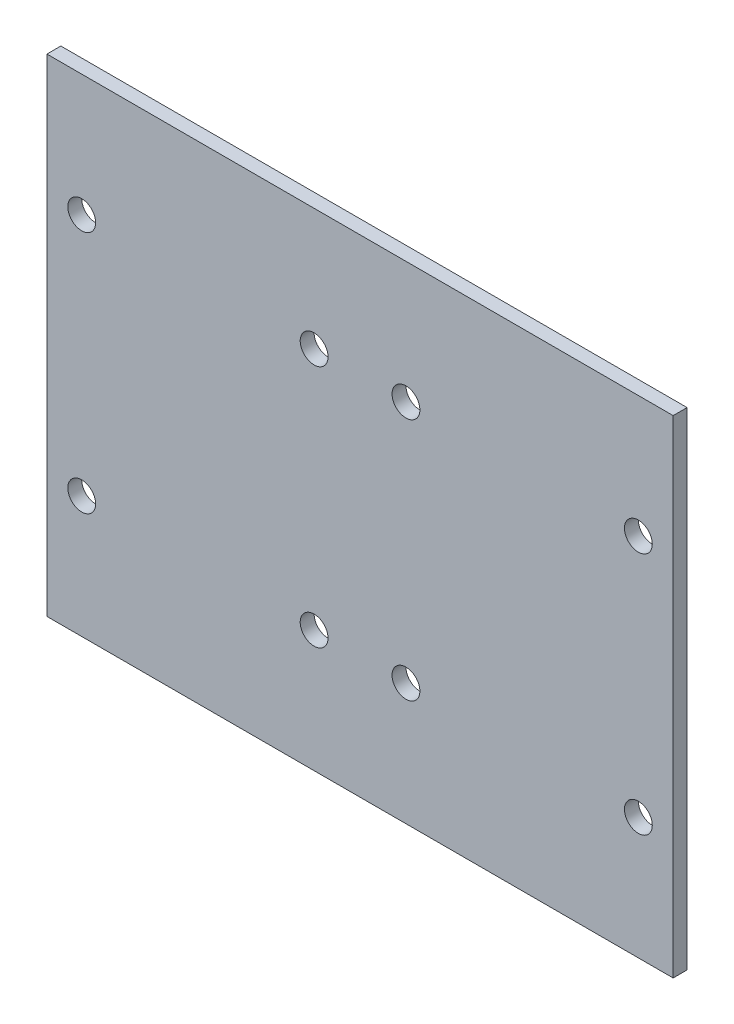
ISO-10303-21;
HEADER;
FILE_DESCRIPTION(('STEP AP214'),'2;1');
FILE_NAME('part.step','',(''),(''),'','','');
FILE_SCHEMA(('AUTOMOTIVE_DESIGN { 1 0 10303 214 1 1 1 1 }'));
ENDSEC;
DATA;
#1=APPLICATION_CONTEXT('core data for automotive mechanical design processes');
#2=APPLICATION_PROTOCOL_DEFINITION('international standard','automotive_design',2000,#1);
#3=PRODUCT_CONTEXT('',#1,'mechanical');
#4=PRODUCT('Part','Part','',(#3));
#5=PRODUCT_RELATED_PRODUCT_CATEGORY('part','',(#4));
#6=PRODUCT_DEFINITION_FORMATION('','',#4);
#7=PRODUCT_DEFINITION_CONTEXT('part definition',#1,'design');
#8=PRODUCT_DEFINITION('design','',#6,#7);
#9=PRODUCT_DEFINITION_SHAPE('','',#8);
#10=(LENGTH_UNIT() NAMED_UNIT(*) SI_UNIT(.MILLI.,.METRE.));
#11=(NAMED_UNIT(*) PLANE_ANGLE_UNIT() SI_UNIT($,.RADIAN.));
#12=(NAMED_UNIT(*) SI_UNIT($,.STERADIAN.) SOLID_ANGLE_UNIT());
#13=UNCERTAINTY_MEASURE_WITH_UNIT(LENGTH_MEASURE(1.E-05),#10,'distance_accuracy_value','');
#14=(GEOMETRIC_REPRESENTATION_CONTEXT(3) GLOBAL_UNCERTAINTY_ASSIGNED_CONTEXT((#13)) GLOBAL_UNIT_ASSIGNED_CONTEXT((#10,
#11,#12)) REPRESENTATION_CONTEXT('',''));
#15=CARTESIAN_POINT('',(0.,0.,0.));
#16=DIRECTION('',(0.,0.,1.));
#17=DIRECTION('',(1.,0.,0.));
#18=AXIS2_PLACEMENT_3D('',#15,#16,#17);
#19=CARTESIAN_POINT('',(0.,0.,2.));
#20=DIRECTION('',(0.,0.,1.));
#21=DIRECTION('',(1.,0.,0.));
#22=AXIS2_PLACEMENT_3D('',#19,#20,#21);
#23=PLANE('',#22);
#24=CARTESIAN_POINT('',(-40.,-17.5,2.));
#25=DIRECTION('',(0.,0.,1.));
#26=DIRECTION('',(1.,0.,0.));
#27=AXIS2_PLACEMENT_3D('',#24,#25,#26);
#28=CIRCLE('',#27,2.);
#29=CARTESIAN_POINT('',(-38.,-17.5,2.));
#30=VERTEX_POINT('',#29);
#31=EDGE_CURVE('E145',#30,#30,#28,.T.);
#32=ORIENTED_EDGE('',*,*,#31,.F.);
#33=EDGE_LOOP('',(#32));
#34=FACE_BOUND('',#33,.T.);
#35=CARTESIAN_POINT('',(-6.6,-17.5,2.));
#36=DIRECTION('',(0.,0.,1.));
#37=DIRECTION('',(1.,0.,0.));
#38=AXIS2_PLACEMENT_3D('',#35,#36,#37);
#39=CIRCLE('',#38,2.);
#40=CARTESIAN_POINT('',(-4.6,-17.5,2.));
#41=VERTEX_POINT('',#40);
#42=EDGE_CURVE('E133',#41,#41,#39,.T.);
#43=ORIENTED_EDGE('',*,*,#42,.F.);
#44=EDGE_LOOP('',(#43));
#45=FACE_BOUND('',#44,.T.);
#46=CARTESIAN_POINT('',(-6.6,17.5,2.));
#47=DIRECTION('',(0.,0.,1.));
#48=DIRECTION('',(1.,0.,0.));
#49=AXIS2_PLACEMENT_3D('',#46,#47,#48);
#50=CIRCLE('',#49,2.);
#51=CARTESIAN_POINT('',(-4.6,17.5,2.));
#52=VERTEX_POINT('',#51);
#53=EDGE_CURVE('E121',#52,#52,#50,.T.);
#54=ORIENTED_EDGE('',*,*,#53,.F.);
#55=EDGE_LOOP('',(#54));
#56=FACE_BOUND('',#55,.T.);
#57=CARTESIAN_POINT('',(6.6,-17.5,2.));
#58=DIRECTION('',(0.,0.,1.));
#59=DIRECTION('',(1.,0.,0.));
#60=AXIS2_PLACEMENT_3D('',#57,#58,#59);
#61=CIRCLE('',#60,2.);
#62=CARTESIAN_POINT('',(8.6,-17.5,2.));
#63=VERTEX_POINT('',#62);
#64=EDGE_CURVE('E100',#63,#63,#61,.T.);
#65=ORIENTED_EDGE('',*,*,#64,.F.);
#66=EDGE_LOOP('',(#65));
#67=FACE_BOUND('',#66,.T.);
#68=DIRECTION('',(0.,1.,0.));
#69=VECTOR('',#68,1.);
#70=CARTESIAN_POINT('',(45.,-35.,2.));
#71=LINE('',#70,#69);
#72=CARTESIAN_POINT('',(45.,-35.,2.));
#73=VERTEX_POINT('',#72);
#74=CARTESIAN_POINT('',(45.,35.,2.));
#75=VERTEX_POINT('',#74);
#76=EDGE_CURVE('E85',#73,#75,#71,.T.);
#77=ORIENTED_EDGE('',*,*,#76,.T.);
#78=DIRECTION('',(-1.,0.,0.));
#79=VECTOR('',#78,1.);
#80=CARTESIAN_POINT('',(45.,35.,2.));
#81=LINE('',#80,#79);
#82=CARTESIAN_POINT('',(-45.,35.,2.));
#83=VERTEX_POINT('',#82);
#84=EDGE_CURVE('E80',#75,#83,#81,.T.);
#85=ORIENTED_EDGE('',*,*,#84,.T.);
#86=DIRECTION('',(0.,-1.,0.));
#87=VECTOR('',#86,1.);
#88=CARTESIAN_POINT('',(-45.,35.,2.));
#89=LINE('',#88,#87);
#90=CARTESIAN_POINT('',(-45.,-35.,2.));
#91=VERTEX_POINT('',#90);
#92=EDGE_CURVE('E83',#83,#91,#89,.T.);
#93=ORIENTED_EDGE('',*,*,#92,.T.);
#94=DIRECTION('',(1.,0.,0.));
#95=VECTOR('',#94,1.);
#96=CARTESIAN_POINT('',(-45.,-35.,2.));
#97=LINE('',#96,#95);
#98=EDGE_CURVE('E50',#91,#73,#97,.T.);
#99=ORIENTED_EDGE('',*,*,#98,.T.);
#100=EDGE_LOOP('',(#77,#85,#93,#99));
#101=FACE_BOUND('',#100,.T.);
#102=CARTESIAN_POINT('',(40.,-17.5,2.));
#103=DIRECTION('',(0.,0.,1.));
#104=DIRECTION('',(1.,0.,0.));
#105=AXIS2_PLACEMENT_3D('',#102,#103,#104);
#106=CIRCLE('',#105,2.);
#107=CARTESIAN_POINT('',(42.,-17.5,2.));
#108=VERTEX_POINT('',#107);
#109=EDGE_CURVE('E115',#108,#108,#106,.T.);
#110=ORIENTED_EDGE('',*,*,#109,.F.);
#111=EDGE_LOOP('',(#110));
#112=FACE_BOUND('',#111,.T.);
#113=CARTESIAN_POINT('',(6.6,17.5,2.));
#114=DIRECTION('',(0.,0.,1.));
#115=DIRECTION('',(1.,0.,0.));
#116=AXIS2_PLACEMENT_3D('',#113,#114,#115);
#117=CIRCLE('',#116,2.);
#118=CARTESIAN_POINT('',(8.6,17.5,2.));
#119=VERTEX_POINT('',#118);
#120=EDGE_CURVE('E127',#119,#119,#117,.T.);
#121=ORIENTED_EDGE('',*,*,#120,.F.);
#122=EDGE_LOOP('',(#121));
#123=FACE_BOUND('',#122,.T.);
#124=CARTESIAN_POINT('',(-40.,17.5,2.));
#125=DIRECTION('',(0.,0.,1.));
#126=DIRECTION('',(1.,0.,0.));
#127=AXIS2_PLACEMENT_3D('',#124,#125,#126);
#128=CIRCLE('',#127,2.);
#129=CARTESIAN_POINT('',(-38.,17.5,2.));
#130=VERTEX_POINT('',#129);
#131=EDGE_CURVE('E139',#130,#130,#128,.T.);
#132=ORIENTED_EDGE('',*,*,#131,.F.);
#133=EDGE_LOOP('',(#132));
#134=FACE_BOUND('',#133,.T.);
#135=CARTESIAN_POINT('',(40.,17.5,2.));
#136=DIRECTION('',(0.,0.,1.));
#137=DIRECTION('',(1.,0.,0.));
#138=AXIS2_PLACEMENT_3D('',#135,#136,#137);
#139=CIRCLE('',#138,2.);
#140=CARTESIAN_POINT('',(42.,17.5,2.));
#141=VERTEX_POINT('',#140);
#142=EDGE_CURVE('E151',#141,#141,#139,.T.);
#143=ORIENTED_EDGE('',*,*,#142,.F.);
#144=EDGE_LOOP('',(#143));
#145=FACE_BOUND('',#144,.T.);
#146=ADVANCED_FACE('F33',(#34,#45,#56,#67,#101,#112,#123,#134,#145),#23,.T.);
#147=CARTESIAN_POINT('',(0.,0.,0.));
#148=DIRECTION('',(0.,0.,1.));
#149=DIRECTION('',(1.,0.,0.));
#150=AXIS2_PLACEMENT_3D('',#147,#148,#149);
#151=PLANE('',#150);
#152=DIRECTION('',(0.,1.,0.));
#153=VECTOR('',#152,1.);
#154=CARTESIAN_POINT('',(45.,-35.,0.));
#155=LINE('',#154,#153);
#156=CARTESIAN_POINT('',(45.,-35.,0.));
#157=VERTEX_POINT('',#156);
#158=CARTESIAN_POINT('',(45.,35.,0.));
#159=VERTEX_POINT('',#158);
#160=EDGE_CURVE('E97',#157,#159,#155,.T.);
#161=ORIENTED_EDGE('',*,*,#160,.F.);
#162=DIRECTION('',(1.,0.,0.));
#163=VECTOR('',#162,1.);
#164=CARTESIAN_POINT('',(-45.,-35.,0.));
#165=LINE('',#164,#163);
#166=CARTESIAN_POINT('',(-45.,-35.,0.));
#167=VERTEX_POINT('',#166);
#168=EDGE_CURVE('E73',#167,#157,#165,.T.);
#169=ORIENTED_EDGE('',*,*,#168,.F.);
#170=DIRECTION('',(0.,-1.,0.));
#171=VECTOR('',#170,1.);
#172=CARTESIAN_POINT('',(-45.,35.,0.));
#173=LINE('',#172,#171);
#174=CARTESIAN_POINT('',(-45.,35.,0.));
#175=VERTEX_POINT('',#174);
#176=EDGE_CURVE('E67',#175,#167,#173,.T.);
#177=ORIENTED_EDGE('',*,*,#176,.F.);
#178=DIRECTION('',(-1.,0.,0.));
#179=VECTOR('',#178,1.);
#180=CARTESIAN_POINT('',(45.,35.,0.));
#181=LINE('',#180,#179);
#182=EDGE_CURVE('E89',#159,#175,#181,.T.);
#183=ORIENTED_EDGE('',*,*,#182,.F.);
#184=EDGE_LOOP('',(#161,#169,#177,#183));
#185=FACE_BOUND('',#184,.T.);
#186=CARTESIAN_POINT('',(6.6,-17.5,0.));
#187=DIRECTION('',(0.,0.,1.));
#188=DIRECTION('',(1.,0.,0.));
#189=AXIS2_PLACEMENT_3D('',#186,#187,#188);
#190=CIRCLE('',#189,2.);
#191=CARTESIAN_POINT('',(8.6,-17.5,0.));
#192=VERTEX_POINT('',#191);
#193=EDGE_CURVE('E112',#192,#192,#190,.T.);
#194=ORIENTED_EDGE('',*,*,#193,.T.);
#195=EDGE_LOOP('',(#194));
#196=FACE_BOUND('',#195,.T.);
#197=CARTESIAN_POINT('',(40.,-17.5,0.));
#198=DIRECTION('',(0.,0.,1.));
#199=DIRECTION('',(1.,0.,0.));
#200=AXIS2_PLACEMENT_3D('',#197,#198,#199);
#201=CIRCLE('',#200,2.);
#202=CARTESIAN_POINT('',(42.,-17.5,0.));
#203=VERTEX_POINT('',#202);
#204=EDGE_CURVE('E118',#203,#203,#201,.T.);
#205=ORIENTED_EDGE('',*,*,#204,.T.);
#206=EDGE_LOOP('',(#205));
#207=FACE_BOUND('',#206,.T.);
#208=CARTESIAN_POINT('',(-6.6,17.5,0.));
#209=DIRECTION('',(0.,0.,1.));
#210=DIRECTION('',(1.,0.,0.));
#211=AXIS2_PLACEMENT_3D('',#208,#209,#210);
#212=CIRCLE('',#211,2.);
#213=CARTESIAN_POINT('',(-4.6,17.5,0.));
#214=VERTEX_POINT('',#213);
#215=EDGE_CURVE('E124',#214,#214,#212,.T.);
#216=ORIENTED_EDGE('',*,*,#215,.T.);
#217=EDGE_LOOP('',(#216));
#218=FACE_BOUND('',#217,.T.);
#219=CARTESIAN_POINT('',(6.6,17.5,0.));
#220=DIRECTION('',(0.,0.,1.));
#221=DIRECTION('',(1.,0.,0.));
#222=AXIS2_PLACEMENT_3D('',#219,#220,#221);
#223=CIRCLE('',#222,2.);
#224=CARTESIAN_POINT('',(8.6,17.5,0.));
#225=VERTEX_POINT('',#224);
#226=EDGE_CURVE('E130',#225,#225,#223,.T.);
#227=ORIENTED_EDGE('',*,*,#226,.T.);
#228=EDGE_LOOP('',(#227));
#229=FACE_BOUND('',#228,.T.);
#230=CARTESIAN_POINT('',(-6.6,-17.5,0.));
#231=DIRECTION('',(0.,0.,1.));
#232=DIRECTION('',(1.,0.,0.));
#233=AXIS2_PLACEMENT_3D('',#230,#231,#232);
#234=CIRCLE('',#233,2.);
#235=CARTESIAN_POINT('',(-4.6,-17.5,0.));
#236=VERTEX_POINT('',#235);
#237=EDGE_CURVE('E136',#236,#236,#234,.T.);
#238=ORIENTED_EDGE('',*,*,#237,.T.);
#239=EDGE_LOOP('',(#238));
#240=FACE_BOUND('',#239,.T.);
#241=CARTESIAN_POINT('',(-40.,17.5,0.));
#242=DIRECTION('',(0.,0.,1.));
#243=DIRECTION('',(1.,0.,0.));
#244=AXIS2_PLACEMENT_3D('',#241,#242,#243);
#245=CIRCLE('',#244,2.);
#246=CARTESIAN_POINT('',(-38.,17.5,0.));
#247=VERTEX_POINT('',#246);
#248=EDGE_CURVE('E142',#247,#247,#245,.T.);
#249=ORIENTED_EDGE('',*,*,#248,.T.);
#250=EDGE_LOOP('',(#249));
#251=FACE_BOUND('',#250,.T.);
#252=CARTESIAN_POINT('',(-40.,-17.5,0.));
#253=DIRECTION('',(0.,0.,1.));
#254=DIRECTION('',(1.,0.,0.));
#255=AXIS2_PLACEMENT_3D('',#252,#253,#254);
#256=CIRCLE('',#255,2.);
#257=CARTESIAN_POINT('',(-38.,-17.5,0.));
#258=VERTEX_POINT('',#257);
#259=EDGE_CURVE('E148',#258,#258,#256,.T.);
#260=ORIENTED_EDGE('',*,*,#259,.T.);
#261=EDGE_LOOP('',(#260));
#262=FACE_BOUND('',#261,.T.);
#263=CARTESIAN_POINT('',(40.,17.5,0.));
#264=DIRECTION('',(0.,0.,1.));
#265=DIRECTION('',(1.,0.,0.));
#266=AXIS2_PLACEMENT_3D('',#263,#264,#265);
#267=CIRCLE('',#266,2.);
#268=CARTESIAN_POINT('',(42.,17.5,0.));
#269=VERTEX_POINT('',#268);
#270=EDGE_CURVE('E154',#269,#269,#267,.T.);
#271=ORIENTED_EDGE('',*,*,#270,.T.);
#272=EDGE_LOOP('',(#271));
#273=FACE_BOUND('',#272,.T.);
#274=ADVANCED_FACE('F108',(#185,#196,#207,#218,#229,#240,#251,#262,#273),#151,.F.);
#275=CARTESIAN_POINT('',(45.,-35.,2.));
#276=DIRECTION('',(-1.,0.,0.));
#277=DIRECTION('',(0.,0.,1.));
#278=AXIS2_PLACEMENT_3D('',#275,#276,#277);
#279=PLANE('',#278);
#280=ORIENTED_EDGE('',*,*,#160,.T.);
#281=DIRECTION('',(0.,0.,-1.));
#282=VECTOR('',#281,1.);
#283=CARTESIAN_POINT('',(45.,35.,2.));
#284=LINE('',#283,#282);
#285=EDGE_CURVE('E11',#75,#159,#284,.T.);
#286=ORIENTED_EDGE('',*,*,#285,.F.);
#287=ORIENTED_EDGE('',*,*,#76,.F.);
#288=DIRECTION('',(0.,0.,-1.));
#289=VECTOR('',#288,1.);
#290=CARTESIAN_POINT('',(45.,-35.,2.));
#291=LINE('',#290,#289);
#292=EDGE_CURVE('E93',#73,#157,#291,.T.);
#293=ORIENTED_EDGE('',*,*,#292,.T.);
#294=EDGE_LOOP('',(#280,#286,#287,#293));
#295=FACE_BOUND('',#294,.T.);
#296=ADVANCED_FACE('F35',(#295),#279,.F.);
#297=CARTESIAN_POINT('',(45.,35.,2.));
#298=DIRECTION('',(0.,-1.,0.));
#299=DIRECTION('',(1.,0.,0.));
#300=AXIS2_PLACEMENT_3D('',#297,#298,#299);
#301=PLANE('',#300);
#302=ORIENTED_EDGE('',*,*,#182,.T.);
#303=DIRECTION('',(0.,0.,-1.));
#304=VECTOR('',#303,1.);
#305=CARTESIAN_POINT('',(-45.,35.,2.));
#306=LINE('',#305,#304);
#307=EDGE_CURVE('E42',#83,#175,#306,.T.);
#308=ORIENTED_EDGE('',*,*,#307,.F.);
#309=ORIENTED_EDGE('',*,*,#84,.F.);
#310=ORIENTED_EDGE('',*,*,#285,.T.);
#311=EDGE_LOOP('',(#302,#308,#309,#310));
#312=FACE_BOUND('',#311,.T.);
#313=ADVANCED_FACE('F88',(#312),#301,.F.);
#314=CARTESIAN_POINT('',(-45.,35.,2.));
#315=DIRECTION('',(1.,0.,0.));
#316=DIRECTION('',(0.,1.,0.));
#317=AXIS2_PLACEMENT_3D('',#314,#315,#316);
#318=PLANE('',#317);
#319=ORIENTED_EDGE('',*,*,#176,.T.);
#320=DIRECTION('',(0.,0.,-1.));
#321=VECTOR('',#320,1.);
#322=CARTESIAN_POINT('',(-45.,-35.,2.));
#323=LINE('',#322,#321);
#324=EDGE_CURVE('E90',#91,#167,#323,.T.);
#325=ORIENTED_EDGE('',*,*,#324,.F.);
#326=ORIENTED_EDGE('',*,*,#92,.F.);
#327=ORIENTED_EDGE('',*,*,#307,.T.);
#328=EDGE_LOOP('',(#319,#325,#326,#327));
#329=FACE_BOUND('',#328,.T.);
#330=ADVANCED_FACE('F91',(#329),#318,.F.);
#331=CARTESIAN_POINT('',(-45.,-35.,2.));
#332=DIRECTION('',(0.,1.,0.));
#333=DIRECTION('',(-1.,0.,0.));
#334=AXIS2_PLACEMENT_3D('',#331,#332,#333);
#335=PLANE('',#334);
#336=ORIENTED_EDGE('',*,*,#168,.T.);
#337=ORIENTED_EDGE('',*,*,#292,.F.);
#338=ORIENTED_EDGE('',*,*,#98,.F.);
#339=ORIENTED_EDGE('',*,*,#324,.T.);
#340=EDGE_LOOP('',(#336,#337,#338,#339));
#341=FACE_BOUND('',#340,.T.);
#342=ADVANCED_FACE('F105',(#341),#335,.F.);
#343=CARTESIAN_POINT('',(6.6,-17.5,2.));
#344=DIRECTION('',(0.,0.,-1.));
#345=DIRECTION('',(-1.,0.,0.));
#346=AXIS2_PLACEMENT_3D('',#343,#344,#345);
#347=CYLINDRICAL_SURFACE('',#346,2.);
#348=ORIENTED_EDGE('',*,*,#64,.T.);
#349=EDGE_LOOP('',(#348));
#350=FACE_BOUND('',#349,.T.);
#351=ORIENTED_EDGE('',*,*,#193,.F.);
#352=EDGE_LOOP('',(#351));
#353=FACE_BOUND('',#352,.T.);
#354=ADVANCED_FACE('F173',(#350,#353),#347,.F.);
#355=CARTESIAN_POINT('',(40.,-17.5,2.));
#356=DIRECTION('',(0.,0.,-1.));
#357=DIRECTION('',(-1.,0.,0.));
#358=AXIS2_PLACEMENT_3D('',#355,#356,#357);
#359=CYLINDRICAL_SURFACE('',#358,2.);
#360=ORIENTED_EDGE('',*,*,#109,.T.);
#361=EDGE_LOOP('',(#360));
#362=FACE_BOUND('',#361,.T.);
#363=ORIENTED_EDGE('',*,*,#204,.F.);
#364=EDGE_LOOP('',(#363));
#365=FACE_BOUND('',#364,.T.);
#366=ADVANCED_FACE('F219',(#362,#365),#359,.F.);
#367=CARTESIAN_POINT('',(-6.6,17.5,2.));
#368=DIRECTION('',(0.,0.,-1.));
#369=DIRECTION('',(-1.,0.,0.));
#370=AXIS2_PLACEMENT_3D('',#367,#368,#369);
#371=CYLINDRICAL_SURFACE('',#370,2.);
#372=ORIENTED_EDGE('',*,*,#53,.T.);
#373=EDGE_LOOP('',(#372));
#374=FACE_BOUND('',#373,.T.);
#375=ORIENTED_EDGE('',*,*,#215,.F.);
#376=EDGE_LOOP('',(#375));
#377=FACE_BOUND('',#376,.T.);
#378=ADVANCED_FACE('F227',(#374,#377),#371,.F.);
#379=CARTESIAN_POINT('',(6.6,17.5,2.));
#380=DIRECTION('',(0.,0.,-1.));
#381=DIRECTION('',(-1.,0.,0.));
#382=AXIS2_PLACEMENT_3D('',#379,#380,#381);
#383=CYLINDRICAL_SURFACE('',#382,2.);
#384=ORIENTED_EDGE('',*,*,#120,.T.);
#385=EDGE_LOOP('',(#384));
#386=FACE_BOUND('',#385,.T.);
#387=ORIENTED_EDGE('',*,*,#226,.F.);
#388=EDGE_LOOP('',(#387));
#389=FACE_BOUND('',#388,.T.);
#390=ADVANCED_FACE('F235',(#386,#389),#383,.F.);
#391=CARTESIAN_POINT('',(-6.6,-17.5,2.));
#392=DIRECTION('',(0.,0.,-1.));
#393=DIRECTION('',(-1.,0.,0.));
#394=AXIS2_PLACEMENT_3D('',#391,#392,#393);
#395=CYLINDRICAL_SURFACE('',#394,2.);
#396=ORIENTED_EDGE('',*,*,#42,.T.);
#397=EDGE_LOOP('',(#396));
#398=FACE_BOUND('',#397,.T.);
#399=ORIENTED_EDGE('',*,*,#237,.F.);
#400=EDGE_LOOP('',(#399));
#401=FACE_BOUND('',#400,.T.);
#402=ADVANCED_FACE('F244',(#398,#401),#395,.F.);
#403=CARTESIAN_POINT('',(-40.,17.5,2.));
#404=DIRECTION('',(0.,0.,-1.));
#405=DIRECTION('',(-1.,0.,0.));
#406=AXIS2_PLACEMENT_3D('',#403,#404,#405);
#407=CYLINDRICAL_SURFACE('',#406,2.);
#408=ORIENTED_EDGE('',*,*,#131,.T.);
#409=EDGE_LOOP('',(#408));
#410=FACE_BOUND('',#409,.T.);
#411=ORIENTED_EDGE('',*,*,#248,.F.);
#412=EDGE_LOOP('',(#411));
#413=FACE_BOUND('',#412,.T.);
#414=ADVANCED_FACE('F253',(#410,#413),#407,.F.);
#415=CARTESIAN_POINT('',(-40.,-17.5,2.));
#416=DIRECTION('',(0.,0.,-1.));
#417=DIRECTION('',(-1.,0.,0.));
#418=AXIS2_PLACEMENT_3D('',#415,#416,#417);
#419=CYLINDRICAL_SURFACE('',#418,2.);
#420=ORIENTED_EDGE('',*,*,#31,.T.);
#421=EDGE_LOOP('',(#420));
#422=FACE_BOUND('',#421,.T.);
#423=ORIENTED_EDGE('',*,*,#259,.F.);
#424=EDGE_LOOP('',(#423));
#425=FACE_BOUND('',#424,.T.);
#426=ADVANCED_FACE('F262',(#422,#425),#419,.F.);
#427=CARTESIAN_POINT('',(40.,17.5,2.));
#428=DIRECTION('',(0.,0.,-1.));
#429=DIRECTION('',(-1.,0.,0.));
#430=AXIS2_PLACEMENT_3D('',#427,#428,#429);
#431=CYLINDRICAL_SURFACE('',#430,2.);
#432=ORIENTED_EDGE('',*,*,#142,.T.);
#433=EDGE_LOOP('',(#432));
#434=FACE_BOUND('',#433,.T.);
#435=ORIENTED_EDGE('',*,*,#270,.F.);
#436=EDGE_LOOP('',(#435));
#437=FACE_BOUND('',#436,.T.);
#438=ADVANCED_FACE('F160',(#434,#437),#431,.F.);
#439=CLOSED_SHELL('',(#146,#274,#296,#313,#330,#342,#354,#366,#378,#390,#402,#414,#426,#438));
#440=MANIFOLD_SOLID_BREP('B2',#439);
#441=ADVANCED_BREP_SHAPE_REPRESENTATION('',(#18,#440),#14);
#442=SHAPE_DEFINITION_REPRESENTATION(#9,#441);
ENDSEC;
END-ISO-10303-21;
